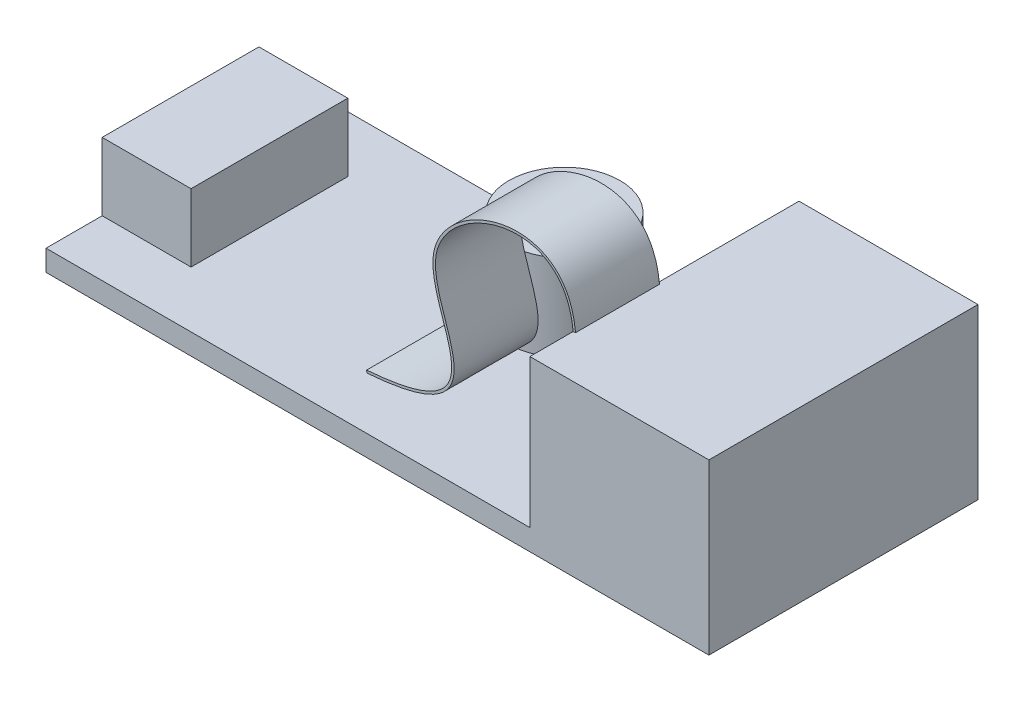
ISO-10303-21;
HEADER;
FILE_DESCRIPTION(('STEP AP214'),'2;1');
FILE_NAME('part.step','',(''),(''),'','','');
FILE_SCHEMA(('AUTOMOTIVE_DESIGN { 1 0 10303 214 1 1 1 1 }'));
ENDSEC;
DATA;
#1=APPLICATION_CONTEXT('core data for automotive mechanical design processes');
#2=APPLICATION_PROTOCOL_DEFINITION('international standard','automotive_design',2000,#1);
#3=PRODUCT_CONTEXT('',#1,'mechanical');
#4=PRODUCT('Part','Part','',(#3));
#5=PRODUCT_RELATED_PRODUCT_CATEGORY('part','',(#4));
#6=PRODUCT_DEFINITION_FORMATION('','',#4);
#7=PRODUCT_DEFINITION_CONTEXT('part definition',#1,'design');
#8=PRODUCT_DEFINITION('design','',#6,#7);
#9=PRODUCT_DEFINITION_SHAPE('','',#8);
#10=(LENGTH_UNIT() NAMED_UNIT(*) SI_UNIT(.MILLI.,.METRE.));
#11=(NAMED_UNIT(*) PLANE_ANGLE_UNIT() SI_UNIT($,.RADIAN.));
#12=(NAMED_UNIT(*) SI_UNIT($,.STERADIAN.) SOLID_ANGLE_UNIT());
#13=UNCERTAINTY_MEASURE_WITH_UNIT(LENGTH_MEASURE(1.E-05),#10,'distance_accuracy_value','');
#14=(GEOMETRIC_REPRESENTATION_CONTEXT(3) GLOBAL_UNCERTAINTY_ASSIGNED_CONTEXT((#13)) GLOBAL_UNIT_ASSIGNED_CONTEXT((#10,
#11,#12)) REPRESENTATION_CONTEXT('',''));
#15=CARTESIAN_POINT('',(0.,0.,0.));
#16=DIRECTION('',(0.,0.,1.));
#17=DIRECTION('',(1.,0.,0.));
#18=AXIS2_PLACEMENT_3D('',#15,#16,#17);
#19=CARTESIAN_POINT('',(22.4908579926513,2.43957396903544,-10.3));
#20=CARTESIAN_POINT('',(34.7035850423354,3.35824717922196,-10.3));
#21=CARTESIAN_POINT('',(19.6659367961775,15.1064134784764,-10.3));
#22=CARTESIAN_POINT('',(38.4876195166047,21.2038980014423,-10.3));
#23=CARTESIAN_POINT('',(39.2,13.7,-10.3));
#24=B_SPLINE_CURVE_WITH_KNOTS('',3,(#19,#20,#21,#22,#23),.UNSPECIFIED.,.F.,.F.,(4,1,4),(0.,
0.500350654647368,1.),.UNSPECIFIED.);
#25=DIRECTION('',(0.,0.,1.));
#26=VECTOR('',#25,1.);
#27=SURFACE_OF_LINEAR_EXTRUSION('',#24,#26);
#28=CARTESIAN_POINT('',(22.4908579926513,2.43957396903544,-3.5));
#29=CARTESIAN_POINT('',(34.7035850423354,3.35824717922196,-3.5));
#30=CARTESIAN_POINT('',(19.6659367961775,15.1064134784764,-3.5));
#31=CARTESIAN_POINT('',(38.4876195166047,21.2038980014423,-3.5));
#32=CARTESIAN_POINT('',(39.2,13.7,-3.5));
#33=B_SPLINE_CURVE_WITH_KNOTS('',3,(#28,#29,#30,#31,#32),.UNSPECIFIED.,.F.,.F.,(4,1,4),(0.,
0.500350654647368,1.),.UNSPECIFIED.);
#34=CARTESIAN_POINT('',(22.4908579926513,2.43957396903544,-3.5));
#35=VERTEX_POINT('',#34);
#36=CARTESIAN_POINT('',(39.2,13.7,-3.5));
#37=VERTEX_POINT('',#36);
#38=EDGE_CURVE('E137',#35,#37,#33,.T.);
#39=ORIENTED_EDGE('',*,*,#38,.F.);
#40=DIRECTION('',(0.,0.,1.));
#41=VECTOR('',#40,1.);
#42=CARTESIAN_POINT('',(22.4908579926513,2.43957396903544,-10.3));
#43=LINE('',#42,#41);
#44=CARTESIAN_POINT('',(22.4908579926513,2.43957396903544,-10.3));
#45=VERTEX_POINT('',#44);
#46=EDGE_CURVE('E12',#45,#35,#43,.T.);
#47=ORIENTED_EDGE('',*,*,#46,.F.);
#48=CARTESIAN_POINT('',(39.2,13.7,-10.3));
#49=VERTEX_POINT('',#48);
#50=EDGE_CURVE('E107',#45,#49,#24,.T.);
#51=ORIENTED_EDGE('',*,*,#50,.T.);
#52=DIRECTION('',(0.,0.,1.));
#53=VECTOR('',#52,1.);
#54=CARTESIAN_POINT('',(39.2,13.7,-10.3));
#55=LINE('',#54,#53);
#56=EDGE_CURVE('E52',#49,#37,#55,.T.);
#57=ORIENTED_EDGE('',*,*,#56,.T.);
#58=EDGE_LOOP('',(#39,#47,#51,#57));
#59=FACE_BOUND('',#58,.T.);
#60=ADVANCED_FACE('F48',(#59),#27,.T.);
#61=CARTESIAN_POINT('',(22.4908579926513,2.43957396903544,-10.3));
#62=DIRECTION('',(-0.997182729829893,-0.0750106880984501,0.));
#63=DIRECTION('',(0.0750106880984501,-0.997182729829893,0.));
#64=AXIS2_PLACEMENT_3D('',#61,#62,#63);
#65=PLANE('',#64);
#66=DIRECTION('',(0.0750106880984501,-0.997182729829893,0.));
#67=VECTOR('',#66,1.);
#68=CARTESIAN_POINT('',(22.4908579926513,2.43957396903544,-3.5));
#69=LINE('',#68,#67);
#70=CARTESIAN_POINT('',(22.4758558550316,2.63901051500142,-3.5));
#71=VERTEX_POINT('',#70);
#72=EDGE_CURVE('E109',#71,#35,#69,.T.);
#73=ORIENTED_EDGE('',*,*,#72,.F.);
#74=DIRECTION('',(0.,0.,1.));
#75=VECTOR('',#74,1.);
#76=CARTESIAN_POINT('',(22.4758558550316,2.63901051500142,-10.3));
#77=LINE('',#76,#75);
#78=CARTESIAN_POINT('',(22.4758558550316,2.63901051500142,-10.3));
#79=VERTEX_POINT('',#78);
#80=EDGE_CURVE('E58',#79,#71,#77,.T.);
#81=ORIENTED_EDGE('',*,*,#80,.F.);
#82=DIRECTION('',(0.0750106880984501,-0.997182729829893,0.));
#83=VECTOR('',#82,1.);
#84=CARTESIAN_POINT('',(22.4908579926513,2.43957396903544,-10.3));
#85=LINE('',#84,#83);
#86=EDGE_CURVE('E104',#79,#45,#85,.T.);
#87=ORIENTED_EDGE('',*,*,#86,.T.);
#88=ORIENTED_EDGE('',*,*,#46,.T.);
#89=EDGE_LOOP('',(#73,#81,#87,#88));
#90=FACE_BOUND('',#89,.T.);
#91=ADVANCED_FACE('F124',(#90),#65,.T.);
#92=CARTESIAN_POINT('',(39.3991047864518,13.718901957888,-10.3));
#93=CARTESIAN_POINT('',(39.3771663698786,13.9499914446378,-10.3));
#94=CARTESIAN_POINT('',(39.3129001368182,14.4227221447659,-10.3));
#95=CARTESIAN_POINT('',(39.1211636735678,15.2576048091152,-10.3));
#96=CARTESIAN_POINT('',(38.762934196934,16.1688320289013,-10.3));
#97=CARTESIAN_POINT('',(38.1681694261647,17.0368558958608,-10.3));
#98=CARTESIAN_POINT('',(37.1898764984351,17.910500102242,-10.3));
#99=CARTESIAN_POINT('',(35.6994846618148,18.4872212708247,-10.3));
#100=CARTESIAN_POINT('',(33.7198545268298,18.4781671539035,-10.3));
#101=CARTESIAN_POINT('',(31.7450060145198,17.8947549523945,-10.3));
#102=CARTESIAN_POINT('',(29.3772771479823,16.5028776043083,-10.3));
#103=CARTESIAN_POINT('',(27.780674524816,14.3641299814865,-10.3));
#104=CARTESIAN_POINT('',(27.8427179666132,11.9325797407129,-10.3));
#105=CARTESIAN_POINT('',(28.357836119357,10.1112872421814,-10.3));
#106=CARTESIAN_POINT('',(28.9943394164916,8.33221498742191,-10.3));
#107=CARTESIAN_POINT('',(29.4222193705876,6.67483347894536,-10.3));
#108=CARTESIAN_POINT('',(29.3309345371462,5.25418428265779,-10.3));
#109=CARTESIAN_POINT('',(28.6143924768212,4.27752424610464,-10.3));
#110=CARTESIAN_POINT('',(27.439642851173,3.6063506439823,-10.3));
#111=CARTESIAN_POINT('',(26.2132370495055,3.18163728202086,-10.3));
#112=CARTESIAN_POINT('',(24.8602162871893,2.90360878029156,-10.3));
#113=CARTESIAN_POINT('',(23.5830563916613,2.73479755239559,-10.3));
#114=CARTESIAN_POINT('',(22.8364313695176,2.66613394648891,-10.3));
#115=CARTESIAN_POINT('',(22.4758558550316,2.63901051500142,-10.3));
#116=B_SPLINE_CURVE_WITH_KNOTS('',3,(#92,#93,#94,#95,#96,#97,#98,#99,#100,#101,#102,#103,#104,
#105,#106,#107,#108,#109,#110,#111,#112,#113,#114,#115),.UNSPECIFIED.,.F.,.F.,(4,1,1,1,1,1,1,1,
1,1,1,1,1,1,1,1,1,1,1,1,1,4),(0.,0.015625,0.03125,0.0625,0.09375,0.125,0.1875,0.25,0.3125,0.375,
0.5,0.5625,0.625,0.6875,0.75,0.8125,0.875,0.90625,0.9375,0.96875,0.984375,1.),.UNSPECIFIED.);
#117=DIRECTION('',(0.,0.,1.));
#118=VECTOR('',#117,1.);
#119=SURFACE_OF_LINEAR_EXTRUSION('',#116,#118);
#120=CARTESIAN_POINT('',(39.3991047864518,13.718901957888,-3.5));
#121=CARTESIAN_POINT('',(39.3771663698786,13.9499914446378,-3.5));
#122=CARTESIAN_POINT('',(39.3129001368182,14.4227221447659,-3.5));
#123=CARTESIAN_POINT('',(39.1211636735678,15.2576048091152,-3.5));
#124=CARTESIAN_POINT('',(38.762934196934,16.1688320289013,-3.5));
#125=CARTESIAN_POINT('',(38.1681694261647,17.0368558958608,-3.5));
#126=CARTESIAN_POINT('',(37.1898764984351,17.910500102242,-3.5));
#127=CARTESIAN_POINT('',(35.6994846618148,18.4872212708247,-3.5));
#128=CARTESIAN_POINT('',(33.7198545268298,18.4781671539035,-3.5));
#129=CARTESIAN_POINT('',(31.7450060145198,17.8947549523945,-3.5));
#130=CARTESIAN_POINT('',(29.3772771479823,16.5028776043083,-3.5));
#131=CARTESIAN_POINT('',(27.780674524816,14.3641299814865,-3.5));
#132=CARTESIAN_POINT('',(27.8427179666132,11.9325797407129,-3.5));
#133=CARTESIAN_POINT('',(28.357836119357,10.1112872421814,-3.5));
#134=CARTESIAN_POINT('',(28.9943394164916,8.33221498742191,-3.5));
#135=CARTESIAN_POINT('',(29.4222193705876,6.67483347894536,-3.5));
#136=CARTESIAN_POINT('',(29.3309345371462,5.25418428265779,-3.5));
#137=CARTESIAN_POINT('',(28.6143924768212,4.27752424610464,-3.5));
#138=CARTESIAN_POINT('',(27.439642851173,3.6063506439823,-3.5));
#139=CARTESIAN_POINT('',(26.2132370495055,3.18163728202086,-3.5));
#140=CARTESIAN_POINT('',(24.8602162871893,2.90360878029156,-3.5));
#141=CARTESIAN_POINT('',(23.5830563916613,2.73479755239559,-3.5));
#142=CARTESIAN_POINT('',(22.8364313695176,2.66613394648891,-3.5));
#143=CARTESIAN_POINT('',(22.4758558550316,2.63901051500142,-3.5));
#144=B_SPLINE_CURVE_WITH_KNOTS('',3,(#120,#121,#122,#123,#124,#125,#126,#127,#128,#129,#130,
#131,#132,#133,#134,#135,#136,#137,#138,#139,#140,#141,#142,#143),.UNSPECIFIED.,.F.,.F.,(4,1,1,
1,1,1,1,1,1,1,1,1,1,1,1,1,1,1,1,1,1,4),(0.,0.015625,0.03125,0.0625,0.09375,0.125,0.1875,0.25,
0.3125,0.375,0.5,0.5625,0.625,0.6875,0.75,0.8125,0.875,0.90625,0.9375,0.96875,0.984375,1.),.UNSPECIFIED.);
#145=CARTESIAN_POINT('',(39.3991047864518,13.718901957888,-3.5));
#146=VERTEX_POINT('',#145);
#147=EDGE_CURVE('E99',#146,#71,#144,.T.);
#148=ORIENTED_EDGE('',*,*,#147,.F.);
#149=DIRECTION('',(0.,0.,1.));
#150=VECTOR('',#149,1.);
#151=CARTESIAN_POINT('',(39.3991047864518,13.718901957888,-10.3));
#152=LINE('',#151,#150);
#153=CARTESIAN_POINT('',(39.3991047864518,13.718901957888,-10.3));
#154=VERTEX_POINT('',#153);
#155=EDGE_CURVE('E94',#154,#146,#152,.T.);
#156=ORIENTED_EDGE('',*,*,#155,.F.);
#157=EDGE_CURVE('E97',#154,#79,#116,.T.);
#158=ORIENTED_EDGE('',*,*,#157,.T.);
#159=ORIENTED_EDGE('',*,*,#80,.T.);
#160=EDGE_LOOP('',(#148,#156,#158,#159));
#161=FACE_BOUND('',#160,.T.);
#162=ADVANCED_FACE('F96',(#161),#119,.T.);
#163=CARTESIAN_POINT('',(39.2,13.7,-10.3));
#164=DIRECTION('',(0.0945097894398162,-0.995523932258809,0.));
#165=DIRECTION('',(0.995523932258809,0.0945097894398162,0.));
#166=AXIS2_PLACEMENT_3D('',#163,#164,#165);
#167=PLANE('',#166);
#168=DIRECTION('',(0.995523932258809,0.0945097894398162,0.));
#169=VECTOR('',#168,1.);
#170=CARTESIAN_POINT('',(39.2,13.7,-3.5));
#171=LINE('',#170,#169);
#172=EDGE_CURVE('E140',#37,#146,#171,.T.);
#173=ORIENTED_EDGE('',*,*,#172,.F.);
#174=ORIENTED_EDGE('',*,*,#56,.F.);
#175=DIRECTION('',(0.995523932258809,0.0945097894398162,0.));
#176=VECTOR('',#175,1.);
#177=CARTESIAN_POINT('',(39.2,13.7,-10.3));
#178=LINE('',#177,#176);
#179=EDGE_CURVE('E103',#49,#154,#178,.T.);
#180=ORIENTED_EDGE('',*,*,#179,.T.);
#181=ORIENTED_EDGE('',*,*,#155,.T.);
#182=EDGE_LOOP('',(#173,#174,#180,#181));
#183=FACE_BOUND('',#182,.T.);
#184=ADVANCED_FACE('F106',(#183),#167,.T.);
#185=CARTESIAN_POINT('',(28.1301102467742,13.6906135115998,-10.3));
#186=DIRECTION('',(0.,0.,-1.));
#187=DIRECTION('',(-1.,0.,0.));
#188=AXIS2_PLACEMENT_3D('',#185,#186,#187);
#189=PLANE('',#188);
#190=ORIENTED_EDGE('',*,*,#50,.F.);
#191=ORIENTED_EDGE('',*,*,#86,.F.);
#192=ORIENTED_EDGE('',*,*,#157,.F.);
#193=ORIENTED_EDGE('',*,*,#179,.F.);
#194=EDGE_LOOP('',(#190,#191,#192,#193));
#195=FACE_BOUND('',#194,.T.);
#196=ADVANCED_FACE('F102',(#195),#189,.T.);
#197=CARTESIAN_POINT('',(28.1301102467742,13.6906135115998,-3.5));
#198=DIRECTION('',(0.,0.,-1.));
#199=DIRECTION('',(-1.,0.,0.));
#200=AXIS2_PLACEMENT_3D('',#197,#198,#199);
#201=PLANE('',#200);
#202=ORIENTED_EDGE('',*,*,#38,.T.);
#203=ORIENTED_EDGE('',*,*,#172,.T.);
#204=ORIENTED_EDGE('',*,*,#147,.T.);
#205=ORIENTED_EDGE('',*,*,#72,.T.);
#206=EDGE_LOOP('',(#202,#203,#204,#205));
#207=FACE_BOUND('',#206,.T.);
#208=ADVANCED_FACE('F130',(#207),#201,.F.);
#209=CLOSED_SHELL('',(#60,#91,#162,#184,#196,#208));
#210=MANIFOLD_SOLID_BREP('B2',#209);
#211=CARTESIAN_POINT('',(0.,1.7,0.));
#212=DIRECTION('',(0.,-1.,0.));
#213=DIRECTION('',(0.,0.,-1.));
#214=AXIS2_PLACEMENT_3D('',#211,#212,#213);
#215=PLANE('',#214);
#216=CARTESIAN_POINT('',(25.5,1.7,-16.5));
#217=DIRECTION('',(0.,-1.,0.));
#218=DIRECTION('',(0.,0.,-1.));
#219=AXIS2_PLACEMENT_3D('',#216,#217,#218);
#220=CIRCLE('',#219,4.5);
#221=CARTESIAN_POINT('',(25.5,1.7,-21.));
#222=VERTEX_POINT('',#221);
#223=EDGE_CURVE('E46',#222,#222,#220,.F.);
#224=ORIENTED_EDGE('',*,*,#223,.F.);
#225=EDGE_LOOP('',(#224));
#226=FACE_BOUND('',#225,.T.);
#227=DIRECTION('',(1.,0.,0.));
#228=VECTOR('',#227,1.);
#229=CARTESIAN_POINT('',(0.,1.7,-4.55));
#230=LINE('',#229,#228);
#231=CARTESIAN_POINT('',(0.,1.7,-4.55));
#232=VERTEX_POINT('',#231);
#233=CARTESIAN_POINT('',(7.2,1.7,-4.55));
#234=VERTEX_POINT('',#233);
#235=EDGE_CURVE('E322',#232,#234,#230,.T.);
#236=ORIENTED_EDGE('',*,*,#235,.F.);
#237=DIRECTION('',(0.,0.,1.));
#238=VECTOR('',#237,1.);
#239=CARTESIAN_POINT('',(0.,1.7,0.));
#240=LINE('',#239,#238);
#241=CARTESIAN_POINT('',(0.,1.7,0.));
#242=VERTEX_POINT('',#241);
#243=EDGE_CURVE('E403',#232,#242,#240,.T.);
#244=ORIENTED_EDGE('',*,*,#243,.T.);
#245=DIRECTION('',(1.,0.,0.));
#246=VECTOR('',#245,1.);
#247=CARTESIAN_POINT('',(0.,1.7,0.));
#248=LINE('',#247,#246);
#249=CARTESIAN_POINT('',(39.2,1.7,0.));
#250=VERTEX_POINT('',#249);
#251=EDGE_CURVE('E402',#242,#250,#248,.T.);
#252=ORIENTED_EDGE('',*,*,#251,.T.);
#253=DIRECTION('',(0.,0.,1.));
#254=VECTOR('',#253,1.);
#255=CARTESIAN_POINT('',(39.2,1.7,-21.8));
#256=LINE('',#255,#254);
#257=CARTESIAN_POINT('',(39.2,1.7,-21.8));
#258=VERTEX_POINT('',#257);
#259=EDGE_CURVE('E373',#258,#250,#256,.T.);
#260=ORIENTED_EDGE('',*,*,#259,.F.);
#261=DIRECTION('',(-1.,0.,0.));
#262=VECTOR('',#261,1.);
#263=CARTESIAN_POINT('',(0.,1.7,-21.8));
#264=LINE('',#263,#262);
#265=CARTESIAN_POINT('',(0.,1.7,-21.8));
#266=VERTEX_POINT('',#265);
#267=EDGE_CURVE('E406',#258,#266,#264,.T.);
#268=ORIENTED_EDGE('',*,*,#267,.T.);
#269=CARTESIAN_POINT('',(0.,1.7,-17.25));
#270=VERTEX_POINT('',#269);
#271=EDGE_CURVE('E399',#266,#270,#240,.T.);
#272=ORIENTED_EDGE('',*,*,#271,.T.);
#273=DIRECTION('',(-1.,0.,0.));
#274=VECTOR('',#273,1.);
#275=CARTESIAN_POINT('',(0.,1.7,-17.25));
#276=LINE('',#275,#274);
#277=CARTESIAN_POINT('',(7.2,1.7,-17.25));
#278=VERTEX_POINT('',#277);
#279=EDGE_CURVE('E338',#278,#270,#276,.T.);
#280=ORIENTED_EDGE('',*,*,#279,.F.);
#281=DIRECTION('',(0.,0.,-1.));
#282=VECTOR('',#281,1.);
#283=CARTESIAN_POINT('',(7.2,1.7,-17.25));
#284=LINE('',#283,#282);
#285=EDGE_CURVE('E327',#234,#278,#284,.T.);
#286=ORIENTED_EDGE('',*,*,#285,.F.);
#287=EDGE_LOOP('',(#236,#244,#252,#260,#268,#272,#280,#286));
#288=FACE_BOUND('',#287,.T.);
#289=ADVANCED_FACE('F194',(#226,#288),#215,.F.);
#290=CARTESIAN_POINT('',(0.,1.7,0.));
#291=DIRECTION('',(1.,0.,0.));
#292=DIRECTION('',(0.,0.,-1.));
#293=AXIS2_PLACEMENT_3D('',#290,#291,#292);
#294=PLANE('',#293);
#295=DIRECTION('',(0.,0.,1.));
#296=VECTOR('',#295,1.);
#297=CARTESIAN_POINT('',(0.,0.,0.));
#298=LINE('',#297,#296);
#299=CARTESIAN_POINT('',(0.,0.,-21.8));
#300=VERTEX_POINT('',#299);
#301=CARTESIAN_POINT('',(0.,0.,-14.9));
#302=VERTEX_POINT('',#301);
#303=EDGE_CURVE('E320',#300,#302,#298,.T.);
#304=ORIENTED_EDGE('',*,*,#303,.T.);
#305=DIRECTION('',(0.,1.,0.));
#306=VECTOR('',#305,1.);
#307=CARTESIAN_POINT('',(0.,-3.5,-14.9));
#308=LINE('',#307,#306);
#309=CARTESIAN_POINT('',(0.,-3.5,-14.9));
#310=VERTEX_POINT('',#309);
#311=EDGE_CURVE('E299',#310,#302,#308,.T.);
#312=ORIENTED_EDGE('',*,*,#311,.F.);
#313=DIRECTION('',(0.,0.,-1.));
#314=VECTOR('',#313,1.);
#315=CARTESIAN_POINT('',(0.,-3.5,-6.9));
#316=LINE('',#315,#314);
#317=CARTESIAN_POINT('',(0.,-3.5,-6.9));
#318=VERTEX_POINT('',#317);
#319=EDGE_CURVE('E306',#318,#310,#316,.T.);
#320=ORIENTED_EDGE('',*,*,#319,.F.);
#321=DIRECTION('',(0.,1.,0.));
#322=VECTOR('',#321,1.);
#323=CARTESIAN_POINT('',(0.,-3.5,-6.9));
#324=LINE('',#323,#322);
#325=CARTESIAN_POINT('',(0.,0.,-6.9));
#326=VERTEX_POINT('',#325);
#327=EDGE_CURVE('E438',#318,#326,#324,.T.);
#328=ORIENTED_EDGE('',*,*,#327,.T.);
#329=CARTESIAN_POINT('',(0.,0.,0.));
#330=VERTEX_POINT('',#329);
#331=EDGE_CURVE('E215',#326,#330,#298,.T.);
#332=ORIENTED_EDGE('',*,*,#331,.T.);
#333=DIRECTION('',(0.,-1.,0.));
#334=VECTOR('',#333,1.);
#335=CARTESIAN_POINT('',(0.,1.7,0.));
#336=LINE('',#335,#334);
#337=EDGE_CURVE('E203',#242,#330,#336,.T.);
#338=ORIENTED_EDGE('',*,*,#337,.F.);
#339=ORIENTED_EDGE('',*,*,#243,.F.);
#340=DIRECTION('',(0.,-1.,0.));
#341=VECTOR('',#340,1.);
#342=CARTESIAN_POINT('',(0.,7.2,-4.55));
#343=LINE('',#342,#341);
#344=CARTESIAN_POINT('',(0.,7.2,-4.55));
#345=VERTEX_POINT('',#344);
#346=EDGE_CURVE('E365',#345,#232,#343,.T.);
#347=ORIENTED_EDGE('',*,*,#346,.F.);
#348=DIRECTION('',(0.,0.,1.));
#349=VECTOR('',#348,1.);
#350=CARTESIAN_POINT('',(0.,7.2,-17.25));
#351=LINE('',#350,#349);
#352=CARTESIAN_POINT('',(0.,7.2,-17.25));
#353=VERTEX_POINT('',#352);
#354=EDGE_CURVE('E333',#353,#345,#351,.T.);
#355=ORIENTED_EDGE('',*,*,#354,.F.);
#356=DIRECTION('',(0.,-1.,0.));
#357=VECTOR('',#356,1.);
#358=CARTESIAN_POINT('',(0.,7.2,-17.25));
#359=LINE('',#358,#357);
#360=EDGE_CURVE('E346',#353,#270,#359,.T.);
#361=ORIENTED_EDGE('',*,*,#360,.T.);
#362=ORIENTED_EDGE('',*,*,#271,.F.);
#363=DIRECTION('',(0.,-1.,0.));
#364=VECTOR('',#363,1.);
#365=CARTESIAN_POINT('',(0.,1.7,-21.8));
#366=LINE('',#365,#364);
#367=EDGE_CURVE('E409',#266,#300,#366,.T.);
#368=ORIENTED_EDGE('',*,*,#367,.T.);
#369=EDGE_LOOP('',(#304,#312,#320,#328,#332,#338,#339,#347,#355,#361,#362,#368));
#370=FACE_BOUND('',#369,.T.);
#371=ADVANCED_FACE('F196',(#370),#294,.F.);
#372=CARTESIAN_POINT('',(0.,1.7,0.));
#373=DIRECTION('',(0.,0.,-1.));
#374=DIRECTION('',(-1.,0.,0.));
#375=AXIS2_PLACEMENT_3D('',#372,#373,#374);
#376=PLANE('',#375);
#377=DIRECTION('',(1.,0.,0.));
#378=VECTOR('',#377,1.);
#379=CARTESIAN_POINT('',(0.,0.,0.));
#380=LINE('',#379,#378);
#381=CARTESIAN_POINT('',(53.7,0.,0.));
#382=VERTEX_POINT('',#381);
#383=EDGE_CURVE('E412',#330,#382,#380,.T.);
#384=ORIENTED_EDGE('',*,*,#383,.T.);
#385=DIRECTION('',(0.,-1.,0.));
#386=VECTOR('',#385,1.);
#387=CARTESIAN_POINT('',(53.7,1.7,0.));
#388=LINE('',#387,#386);
#389=CARTESIAN_POINT('',(53.7,13.7,0.));
#390=VERTEX_POINT('',#389);
#391=EDGE_CURVE('E427',#390,#382,#388,.T.);
#392=ORIENTED_EDGE('',*,*,#391,.F.);
#393=DIRECTION('',(1.,0.,0.));
#394=VECTOR('',#393,1.);
#395=CARTESIAN_POINT('',(53.7,13.7,0.));
#396=LINE('',#395,#394);
#397=CARTESIAN_POINT('',(39.2,13.7,0.));
#398=VERTEX_POINT('',#397);
#399=EDGE_CURVE('E384',#398,#390,#396,.T.);
#400=ORIENTED_EDGE('',*,*,#399,.F.);
#401=DIRECTION('',(0.,-1.,0.));
#402=VECTOR('',#401,1.);
#403=CARTESIAN_POINT('',(39.2,13.7,0.));
#404=LINE('',#403,#402);
#405=EDGE_CURVE('E388',#398,#250,#404,.T.);
#406=ORIENTED_EDGE('',*,*,#405,.T.);
#407=ORIENTED_EDGE('',*,*,#251,.F.);
#408=ORIENTED_EDGE('',*,*,#337,.T.);
#409=EDGE_LOOP('',(#384,#392,#400,#406,#407,#408));
#410=FACE_BOUND('',#409,.T.);
#411=ADVANCED_FACE('F435',(#410),#376,.F.);
#412=CARTESIAN_POINT('',(53.7,1.7,0.));
#413=DIRECTION('',(-1.,0.,0.));
#414=DIRECTION('',(0.,0.,1.));
#415=AXIS2_PLACEMENT_3D('',#412,#413,#414);
#416=PLANE('',#415);
#417=DIRECTION('',(0.,0.,-1.));
#418=VECTOR('',#417,1.);
#419=CARTESIAN_POINT('',(53.7,0.,0.));
#420=LINE('',#419,#418);
#421=CARTESIAN_POINT('',(53.7,0.,-21.8));
#422=VERTEX_POINT('',#421);
#423=EDGE_CURVE('E415',#382,#422,#420,.T.);
#424=ORIENTED_EDGE('',*,*,#423,.T.);
#425=DIRECTION('',(0.,-1.,0.));
#426=VECTOR('',#425,1.);
#427=CARTESIAN_POINT('',(53.7,1.7,-21.8));
#428=LINE('',#427,#426);
#429=CARTESIAN_POINT('',(53.7,13.7,-21.8));
#430=VERTEX_POINT('',#429);
#431=EDGE_CURVE('E423',#430,#422,#428,.T.);
#432=ORIENTED_EDGE('',*,*,#431,.F.);
#433=DIRECTION('',(0.,0.,-1.));
#434=VECTOR('',#433,1.);
#435=CARTESIAN_POINT('',(53.7,13.7,-21.8));
#436=LINE('',#435,#434);
#437=EDGE_CURVE('E374',#390,#430,#436,.T.);
#438=ORIENTED_EDGE('',*,*,#437,.F.);
#439=ORIENTED_EDGE('',*,*,#391,.T.);
#440=EDGE_LOOP('',(#424,#432,#438,#439));
#441=FACE_BOUND('',#440,.T.);
#442=ADVANCED_FACE('F444',(#441),#416,.F.);
#443=CARTESIAN_POINT('',(0.,1.7,-21.8));
#444=DIRECTION('',(0.,0.,1.));
#445=DIRECTION('',(1.,0.,0.));
#446=AXIS2_PLACEMENT_3D('',#443,#444,#445);
#447=PLANE('',#446);
#448=DIRECTION('',(-1.,0.,0.));
#449=VECTOR('',#448,1.);
#450=CARTESIAN_POINT('',(0.,0.,-21.8));
#451=LINE('',#450,#449);
#452=EDGE_CURVE('E418',#422,#300,#451,.T.);
#453=ORIENTED_EDGE('',*,*,#452,.T.);
#454=ORIENTED_EDGE('',*,*,#367,.F.);
#455=ORIENTED_EDGE('',*,*,#267,.F.);
#456=DIRECTION('',(0.,-1.,0.));
#457=VECTOR('',#456,1.);
#458=CARTESIAN_POINT('',(39.2,13.7,-21.8));
#459=LINE('',#458,#457);
#460=CARTESIAN_POINT('',(39.2,13.7,-21.8));
#461=VERTEX_POINT('',#460);
#462=EDGE_CURVE('E395',#461,#258,#459,.T.);
#463=ORIENTED_EDGE('',*,*,#462,.F.);
#464=DIRECTION('',(-1.,0.,0.));
#465=VECTOR('',#464,1.);
#466=CARTESIAN_POINT('',(53.7,13.7,-21.8));
#467=LINE('',#466,#465);
#468=EDGE_CURVE('E378',#430,#461,#467,.T.);
#469=ORIENTED_EDGE('',*,*,#468,.F.);
#470=ORIENTED_EDGE('',*,*,#431,.T.);
#471=EDGE_LOOP('',(#453,#454,#455,#463,#469,#470));
#472=FACE_BOUND('',#471,.T.);
#473=ADVANCED_FACE('F448',(#472),#447,.F.);
#474=CARTESIAN_POINT('',(0.,0.,0.));
#475=DIRECTION('',(0.,-1.,0.));
#476=DIRECTION('',(0.,0.,-1.));
#477=AXIS2_PLACEMENT_3D('',#474,#475,#476);
#478=PLANE('',#477);
#479=DIRECTION('',(-1.,0.,0.));
#480=VECTOR('',#479,1.);
#481=CARTESIAN_POINT('',(0.,0.,-6.9));
#482=LINE('',#481,#480);
#483=CARTESIAN_POINT('',(6.,0.,-6.9));
#484=VERTEX_POINT('',#483);
#485=EDGE_CURVE('E210',#484,#326,#482,.T.);
#486=ORIENTED_EDGE('',*,*,#485,.F.);
#487=DIRECTION('',(0.,0.,1.));
#488=VECTOR('',#487,1.);
#489=CARTESIAN_POINT('',(6.,0.,-6.9));
#490=LINE('',#489,#488);
#491=CARTESIAN_POINT('',(6.,0.,-14.9));
#492=VERTEX_POINT('',#491);
#493=EDGE_CURVE('E611',#492,#484,#490,.T.);
#494=ORIENTED_EDGE('',*,*,#493,.F.);
#495=DIRECTION('',(1.,0.,0.));
#496=VECTOR('',#495,1.);
#497=CARTESIAN_POINT('',(0.,0.,-14.9));
#498=LINE('',#497,#496);
#499=EDGE_CURVE('E614',#302,#492,#498,.T.);
#500=ORIENTED_EDGE('',*,*,#499,.F.);
#501=ORIENTED_EDGE('',*,*,#303,.F.);
#502=ORIENTED_EDGE('',*,*,#452,.F.);
#503=ORIENTED_EDGE('',*,*,#423,.F.);
#504=ORIENTED_EDGE('',*,*,#383,.F.);
#505=ORIENTED_EDGE('',*,*,#331,.F.);
#506=EDGE_LOOP('',(#486,#494,#500,#501,#502,#503,#504,#505));
#507=FACE_BOUND('',#506,.T.);
#508=ADVANCED_FACE('F441',(#507),#478,.T.);
#509=CARTESIAN_POINT('',(39.2,13.7,-21.8));
#510=DIRECTION('',(1.,0.,0.));
#511=DIRECTION('',(0.,0.,-1.));
#512=AXIS2_PLACEMENT_3D('',#509,#510,#511);
#513=PLANE('',#512);
#514=ORIENTED_EDGE('',*,*,#259,.T.);
#515=ORIENTED_EDGE('',*,*,#405,.F.);
#516=DIRECTION('',(0.,0.,1.));
#517=VECTOR('',#516,1.);
#518=CARTESIAN_POINT('',(39.2,13.7,-21.8));
#519=LINE('',#518,#517);
#520=EDGE_CURVE('E381',#461,#398,#519,.T.);
#521=ORIENTED_EDGE('',*,*,#520,.F.);
#522=ORIENTED_EDGE('',*,*,#462,.T.);
#523=EDGE_LOOP('',(#514,#515,#521,#522));
#524=FACE_BOUND('',#523,.T.);
#525=ADVANCED_FACE('F458',(#524),#513,.F.);
#526=CARTESIAN_POINT('',(0.,13.7,0.));
#527=DIRECTION('',(0.,-1.,0.));
#528=DIRECTION('',(0.,0.,-1.));
#529=AXIS2_PLACEMENT_3D('',#526,#527,#528);
#530=PLANE('',#529);
#531=ORIENTED_EDGE('',*,*,#437,.T.);
#532=ORIENTED_EDGE('',*,*,#468,.T.);
#533=ORIENTED_EDGE('',*,*,#520,.T.);
#534=ORIENTED_EDGE('',*,*,#399,.T.);
#535=EDGE_LOOP('',(#531,#532,#533,#534));
#536=FACE_BOUND('',#535,.T.);
#537=ADVANCED_FACE('F454',(#536),#530,.F.);
#538=CARTESIAN_POINT('',(25.5,8.7,-16.5));
#539=DIRECTION('',(0.,-1.,0.));
#540=DIRECTION('',(0.,0.,-1.));
#541=AXIS2_PLACEMENT_3D('',#538,#539,#540);
#542=CYLINDRICAL_SURFACE('',#541,4.5);
#543=CARTESIAN_POINT('',(25.5,8.7,-16.5));
#544=DIRECTION('',(0.,1.,0.));
#545=DIRECTION('',(0.,0.,1.));
#546=AXIS2_PLACEMENT_3D('',#543,#544,#545);
#547=CIRCLE('',#546,4.5);
#548=CARTESIAN_POINT('',(25.5,8.7,-12.));
#549=VERTEX_POINT('',#548);
#550=EDGE_CURVE('E369',#549,#549,#547,.T.);
#551=ORIENTED_EDGE('',*,*,#550,.F.);
#552=EDGE_LOOP('',(#551));
#553=FACE_BOUND('',#552,.T.);
#554=ORIENTED_EDGE('',*,*,#223,.T.);
#555=EDGE_LOOP('',(#554));
#556=FACE_BOUND('',#555,.T.);
#557=ADVANCED_FACE('F528',(#553,#556),#542,.T.);
#558=CARTESIAN_POINT('',(25.5,8.7,-16.5));
#559=DIRECTION('',(0.,1.,0.));
#560=DIRECTION('',(0.,0.,1.));
#561=AXIS2_PLACEMENT_3D('',#558,#559,#560);
#562=PLANE('',#561);
#563=ORIENTED_EDGE('',*,*,#550,.T.);
#564=EDGE_LOOP('',(#563));
#565=FACE_BOUND('',#564,.T.);
#566=ADVANCED_FACE('F534',(#565),#562,.T.);
#567=CARTESIAN_POINT('',(0.,7.2,-4.55));
#568=DIRECTION('',(0.,0.,-1.));
#569=DIRECTION('',(-1.,0.,0.));
#570=AXIS2_PLACEMENT_3D('',#567,#568,#569);
#571=PLANE('',#570);
#572=ORIENTED_EDGE('',*,*,#235,.T.);
#573=DIRECTION('',(0.,-1.,0.));
#574=VECTOR('',#573,1.);
#575=CARTESIAN_POINT('',(7.2,7.2,-4.55));
#576=LINE('',#575,#574);
#577=CARTESIAN_POINT('',(7.2,7.2,-4.55));
#578=VERTEX_POINT('',#577);
#579=EDGE_CURVE('E361',#578,#234,#576,.T.);
#580=ORIENTED_EDGE('',*,*,#579,.F.);
#581=DIRECTION('',(1.,0.,0.));
#582=VECTOR('',#581,1.);
#583=CARTESIAN_POINT('',(0.,7.2,-4.55));
#584=LINE('',#583,#582);
#585=EDGE_CURVE('E337',#345,#578,#584,.T.);
#586=ORIENTED_EDGE('',*,*,#585,.F.);
#587=ORIENTED_EDGE('',*,*,#346,.T.);
#588=EDGE_LOOP('',(#572,#580,#586,#587));
#589=FACE_BOUND('',#588,.T.);
#590=ADVANCED_FACE('F472',(#589),#571,.F.);
#591=CARTESIAN_POINT('',(7.2,7.2,-17.25));
#592=DIRECTION('',(-1.,0.,0.));
#593=DIRECTION('',(0.,0.,1.));
#594=AXIS2_PLACEMENT_3D('',#591,#592,#593);
#595=PLANE('',#594);
#596=ORIENTED_EDGE('',*,*,#285,.T.);
#597=DIRECTION('',(0.,-1.,0.));
#598=VECTOR('',#597,1.);
#599=CARTESIAN_POINT('',(7.2,7.2,-17.25));
#600=LINE('',#599,#598);
#601=CARTESIAN_POINT('',(7.2,7.2,-17.25));
#602=VERTEX_POINT('',#601);
#603=EDGE_CURVE('E357',#602,#278,#600,.T.);
#604=ORIENTED_EDGE('',*,*,#603,.F.);
#605=DIRECTION('',(0.,0.,-1.));
#606=VECTOR('',#605,1.);
#607=CARTESIAN_POINT('',(7.2,7.2,-17.25));
#608=LINE('',#607,#606);
#609=EDGE_CURVE('E341',#578,#602,#608,.T.);
#610=ORIENTED_EDGE('',*,*,#609,.F.);
#611=ORIENTED_EDGE('',*,*,#579,.T.);
#612=EDGE_LOOP('',(#596,#604,#610,#611));
#613=FACE_BOUND('',#612,.T.);
#614=ADVANCED_FACE('F469',(#613),#595,.F.);
#615=CARTESIAN_POINT('',(0.,7.2,-17.25));
#616=DIRECTION('',(0.,0.,1.));
#617=DIRECTION('',(1.,0.,0.));
#618=AXIS2_PLACEMENT_3D('',#615,#616,#617);
#619=PLANE('',#618);
#620=ORIENTED_EDGE('',*,*,#279,.T.);
#621=ORIENTED_EDGE('',*,*,#360,.F.);
#622=DIRECTION('',(-1.,0.,0.));
#623=VECTOR('',#622,1.);
#624=CARTESIAN_POINT('',(0.,7.2,-17.25));
#625=LINE('',#624,#623);
#626=EDGE_CURVE('E344',#602,#353,#625,.T.);
#627=ORIENTED_EDGE('',*,*,#626,.F.);
#628=ORIENTED_EDGE('',*,*,#603,.T.);
#629=EDGE_LOOP('',(#620,#621,#627,#628));
#630=FACE_BOUND('',#629,.T.);
#631=ADVANCED_FACE('F464',(#630),#619,.F.);
#632=CARTESIAN_POINT('',(0.,7.2,0.));
#633=DIRECTION('',(0.,1.,0.));
#634=DIRECTION('',(0.,0.,1.));
#635=AXIS2_PLACEMENT_3D('',#632,#633,#634);
#636=PLANE('',#635);
#637=ORIENTED_EDGE('',*,*,#354,.T.);
#638=ORIENTED_EDGE('',*,*,#585,.T.);
#639=ORIENTED_EDGE('',*,*,#609,.T.);
#640=ORIENTED_EDGE('',*,*,#626,.T.);
#641=EDGE_LOOP('',(#637,#638,#639,#640));
#642=FACE_BOUND('',#641,.T.);
#643=ADVANCED_FACE('F474',(#642),#636,.T.);
#644=CARTESIAN_POINT('',(0.,-3.5,-14.9));
#645=DIRECTION('',(0.,0.,1.));
#646=DIRECTION('',(1.,0.,0.));
#647=AXIS2_PLACEMENT_3D('',#644,#645,#646);
#648=PLANE('',#647);
#649=ORIENTED_EDGE('',*,*,#499,.T.);
#650=DIRECTION('',(0.,1.,0.));
#651=VECTOR('',#650,1.);
#652=CARTESIAN_POINT('',(6.,-3.5,-14.9));
#653=LINE('',#652,#651);
#654=CARTESIAN_POINT('',(6.,-3.5,-14.9));
#655=VERTEX_POINT('',#654);
#656=EDGE_CURVE('E301',#655,#492,#653,.T.);
#657=ORIENTED_EDGE('',*,*,#656,.F.);
#658=DIRECTION('',(1.,0.,0.));
#659=VECTOR('',#658,1.);
#660=CARTESIAN_POINT('',(0.,-3.5,-14.9));
#661=LINE('',#660,#659);
#662=EDGE_CURVE('E294',#310,#655,#661,.T.);
#663=ORIENTED_EDGE('',*,*,#662,.F.);
#664=ORIENTED_EDGE('',*,*,#311,.T.);
#665=EDGE_LOOP('',(#649,#657,#663,#664));
#666=FACE_BOUND('',#665,.T.);
#667=ADVANCED_FACE('F297',(#666),#648,.F.);
#668=CARTESIAN_POINT('',(6.,-3.5,-6.9));
#669=DIRECTION('',(-1.,0.,0.));
#670=DIRECTION('',(0.,0.,1.));
#671=AXIS2_PLACEMENT_3D('',#668,#669,#670);
#672=PLANE('',#671);
#673=ORIENTED_EDGE('',*,*,#493,.T.);
#674=DIRECTION('',(0.,1.,0.));
#675=VECTOR('',#674,1.);
#676=CARTESIAN_POINT('',(6.,-3.5,-6.9));
#677=LINE('',#676,#675);
#678=CARTESIAN_POINT('',(6.,-3.5,-6.9));
#679=VERTEX_POINT('',#678);
#680=EDGE_CURVE('E329',#679,#484,#677,.T.);
#681=ORIENTED_EDGE('',*,*,#680,.F.);
#682=DIRECTION('',(0.,0.,1.));
#683=VECTOR('',#682,1.);
#684=CARTESIAN_POINT('',(6.,-3.5,-6.9));
#685=LINE('',#684,#683);
#686=EDGE_CURVE('E305',#655,#679,#685,.T.);
#687=ORIENTED_EDGE('',*,*,#686,.F.);
#688=ORIENTED_EDGE('',*,*,#656,.T.);
#689=EDGE_LOOP('',(#673,#681,#687,#688));
#690=FACE_BOUND('',#689,.T.);
#691=ADVANCED_FACE('F481',(#690),#672,.F.);
#692=CARTESIAN_POINT('',(0.,-3.5,-6.9));
#693=DIRECTION('',(0.,0.,-1.));
#694=DIRECTION('',(-1.,0.,0.));
#695=AXIS2_PLACEMENT_3D('',#692,#693,#694);
#696=PLANE('',#695);
#697=ORIENTED_EDGE('',*,*,#485,.T.);
#698=ORIENTED_EDGE('',*,*,#327,.F.);
#699=DIRECTION('',(-1.,0.,0.));
#700=VECTOR('',#699,1.);
#701=CARTESIAN_POINT('',(0.,-3.5,-6.9));
#702=LINE('',#701,#700);
#703=EDGE_CURVE('E311',#679,#318,#702,.T.);
#704=ORIENTED_EDGE('',*,*,#703,.F.);
#705=ORIENTED_EDGE('',*,*,#680,.T.);
#706=EDGE_LOOP('',(#697,#698,#704,#705));
#707=FACE_BOUND('',#706,.T.);
#708=ADVANCED_FACE('F586',(#707),#696,.F.);
#709=CARTESIAN_POINT('',(0.,-3.5,0.));
#710=DIRECTION('',(0.,-1.,0.));
#711=DIRECTION('',(0.,0.,-1.));
#712=AXIS2_PLACEMENT_3D('',#709,#710,#711);
#713=PLANE('',#712);
#714=ORIENTED_EDGE('',*,*,#319,.T.);
#715=ORIENTED_EDGE('',*,*,#662,.T.);
#716=ORIENTED_EDGE('',*,*,#686,.T.);
#717=ORIENTED_EDGE('',*,*,#703,.T.);
#718=EDGE_LOOP('',(#714,#715,#716,#717));
#719=FACE_BOUND('',#718,.T.);
#720=ADVANCED_FACE('F309',(#719),#713,.T.);
#721=CLOSED_SHELL('',(#289,#371,#411,#442,#473,#508,#525,#537,#557,#566,#590,#614,#631,#643,
#667,#691,#708,#720));
#722=MANIFOLD_SOLID_BREP('B6',#721);
#723=ADVANCED_BREP_SHAPE_REPRESENTATION('',(#18,#210,#722),#14);
#724=SHAPE_DEFINITION_REPRESENTATION(#9,#723);
ENDSEC;
END-ISO-10303-21;
